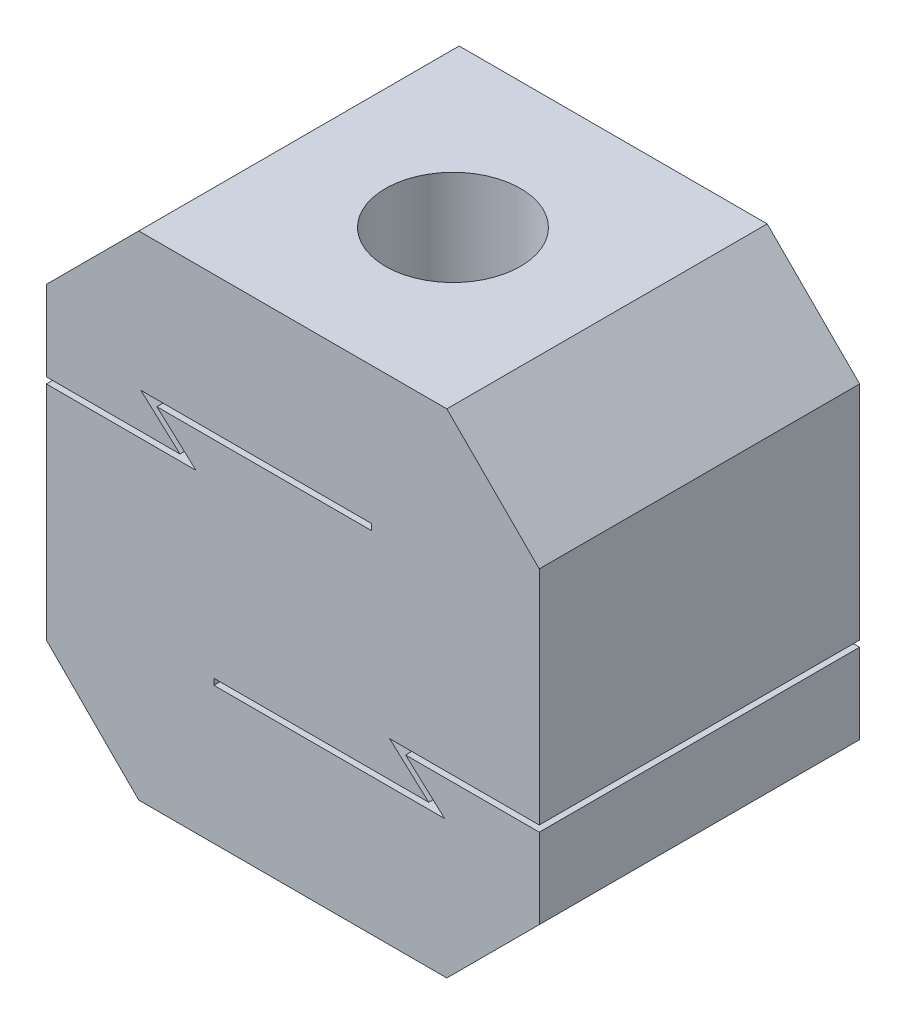
ISO-10303-21;
HEADER;
FILE_DESCRIPTION(('STEP AP214'),'2;1');
FILE_NAME('part.step','',(''),(''),'','','');
FILE_SCHEMA(('AUTOMOTIVE_DESIGN { 1 0 10303 214 1 1 1 1 }'));
ENDSEC;
DATA;
#1=APPLICATION_CONTEXT('core data for automotive mechanical design processes');
#2=APPLICATION_PROTOCOL_DEFINITION('international standard','automotive_design',2000,#1);
#3=PRODUCT_CONTEXT('',#1,'mechanical');
#4=PRODUCT('Part','Part','',(#3));
#5=PRODUCT_RELATED_PRODUCT_CATEGORY('part','',(#4));
#6=PRODUCT_DEFINITION_FORMATION('','',#4);
#7=PRODUCT_DEFINITION_CONTEXT('part definition',#1,'design');
#8=PRODUCT_DEFINITION('design','',#6,#7);
#9=PRODUCT_DEFINITION_SHAPE('','',#8);
#10=(LENGTH_UNIT() NAMED_UNIT(*) SI_UNIT(.MILLI.,.METRE.));
#11=(NAMED_UNIT(*) PLANE_ANGLE_UNIT() SI_UNIT($,.RADIAN.));
#12=(NAMED_UNIT(*) SI_UNIT($,.STERADIAN.) SOLID_ANGLE_UNIT());
#13=UNCERTAINTY_MEASURE_WITH_UNIT(LENGTH_MEASURE(1.E-05),#10,'distance_accuracy_value','');
#14=(GEOMETRIC_REPRESENTATION_CONTEXT(3) GLOBAL_UNCERTAINTY_ASSIGNED_CONTEXT((#13)) GLOBAL_UNIT_ASSIGNED_CONTEXT((#10,
#11,#12)) REPRESENTATION_CONTEXT('',''));
#15=CARTESIAN_POINT('',(0.,0.,0.));
#16=DIRECTION('',(0.,0.,1.));
#17=DIRECTION('',(1.,0.,0.));
#18=AXIS2_PLACEMENT_3D('',#15,#16,#17);
#19=CARTESIAN_POINT('',(40.,40.,52.));
#20=DIRECTION('',(-1.,0.,0.));
#21=DIRECTION('',(0.,-1.,0.));
#22=AXIS2_PLACEMENT_3D('',#19,#20,#21);
#23=PLANE('',#22);
#24=DIRECTION('',(0.,0.,1.));
#25=VECTOR('',#24,1.);
#26=CARTESIAN_POINT('',(40.,-10.9999999999999,52.));
#27=LINE('',#26,#25);
#28=CARTESIAN_POINT('',(40.,-10.9999999999999,0.));
#29=VERTEX_POINT('',#28);
#30=CARTESIAN_POINT('',(40.,-10.9999999999999,52.));
#31=VERTEX_POINT('',#30);
#32=EDGE_CURVE('E243',#29,#31,#27,.T.);
#33=ORIENTED_EDGE('',*,*,#32,.F.);
#34=DIRECTION('',(0.,1.,0.));
#35=VECTOR('',#34,1.);
#36=CARTESIAN_POINT('',(40.,40.,0.));
#37=LINE('',#36,#35);
#38=CARTESIAN_POINT('',(40.,25.,0.));
#39=VERTEX_POINT('',#38);
#40=EDGE_CURVE('E293',#29,#39,#37,.T.);
#41=ORIENTED_EDGE('',*,*,#40,.T.);
#42=DIRECTION('',(0.,0.,1.));
#43=VECTOR('',#42,1.);
#44=CARTESIAN_POINT('',(40.,25.,52.));
#45=LINE('',#44,#43);
#46=CARTESIAN_POINT('',(40.,25.,52.));
#47=VERTEX_POINT('',#46);
#48=EDGE_CURVE('E350',#39,#47,#45,.T.);
#49=ORIENTED_EDGE('',*,*,#48,.T.);
#50=DIRECTION('',(0.,1.,0.));
#51=VECTOR('',#50,1.);
#52=CARTESIAN_POINT('',(40.,40.,52.));
#53=LINE('',#52,#51);
#54=EDGE_CURVE('E298',#31,#47,#53,.T.);
#55=ORIENTED_EDGE('',*,*,#54,.F.);
#56=EDGE_LOOP('',(#33,#41,#49,#55));
#57=FACE_BOUND('',#56,.T.);
#58=ADVANCED_FACE('F41',(#57),#23,.F.);
#59=CARTESIAN_POINT('',(-40.,40.,52.));
#60=DIRECTION('',(1.,0.,0.));
#61=DIRECTION('',(0.,1.,0.));
#62=AXIS2_PLACEMENT_3D('',#59,#60,#61);
#63=PLANE('',#62);
#64=DIRECTION('',(0.,0.,1.));
#65=VECTOR('',#64,1.);
#66=CARTESIAN_POINT('',(-40.,11.,52.));
#67=LINE('',#66,#65);
#68=CARTESIAN_POINT('',(-40.,11.,0.));
#69=VERTEX_POINT('',#68);
#70=CARTESIAN_POINT('',(-40.,11.,52.));
#71=VERTEX_POINT('',#70);
#72=EDGE_CURVE('E288',#69,#71,#67,.T.);
#73=ORIENTED_EDGE('',*,*,#72,.F.);
#74=DIRECTION('',(0.,-1.,0.));
#75=VECTOR('',#74,1.);
#76=CARTESIAN_POINT('',(-40.,40.,0.));
#77=LINE('',#76,#75);
#78=CARTESIAN_POINT('',(-40.,-24.9999999999999,0.));
#79=VERTEX_POINT('',#78);
#80=EDGE_CURVE('E315',#69,#79,#77,.T.);
#81=ORIENTED_EDGE('',*,*,#80,.T.);
#82=DIRECTION('',(0.,0.,1.));
#83=VECTOR('',#82,1.);
#84=CARTESIAN_POINT('',(-40.,-24.9999999999999,52.));
#85=LINE('',#84,#83);
#86=CARTESIAN_POINT('',(-40.,-24.9999999999999,52.));
#87=VERTEX_POINT('',#86);
#88=EDGE_CURVE('E339',#79,#87,#85,.T.);
#89=ORIENTED_EDGE('',*,*,#88,.T.);
#90=DIRECTION('',(0.,-1.,0.));
#91=VECTOR('',#90,1.);
#92=CARTESIAN_POINT('',(-40.,40.,52.));
#93=LINE('',#92,#91);
#94=EDGE_CURVE('E301',#71,#87,#93,.T.);
#95=ORIENTED_EDGE('',*,*,#94,.F.);
#96=EDGE_LOOP('',(#73,#81,#89,#95));
#97=FACE_BOUND('',#96,.T.);
#98=ADVANCED_FACE('F462',(#97),#63,.F.);
#99=CARTESIAN_POINT('',(40.,-25.,0.));
#100=VERTEX_POINT('',#99);
#101=CARTESIAN_POINT('',(40.,-11.9999999999999,0.));
#102=VERTEX_POINT('',#101);
#103=EDGE_CURVE('E309',#100,#102,#37,.T.);
#104=ORIENTED_EDGE('',*,*,#103,.T.);
#105=DIRECTION('',(0.,0.,1.));
#106=VECTOR('',#105,1.);
#107=CARTESIAN_POINT('',(40.,-11.9999999999999,52.));
#108=LINE('',#107,#106);
#109=CARTESIAN_POINT('',(40.,-11.9999999999999,52.));
#110=VERTEX_POINT('',#109);
#111=EDGE_CURVE('E285',#102,#110,#108,.T.);
#112=ORIENTED_EDGE('',*,*,#111,.T.);
#113=CARTESIAN_POINT('',(40.,-25.,52.));
#114=VERTEX_POINT('',#113);
#115=EDGE_CURVE('E294',#114,#110,#53,.T.);
#116=ORIENTED_EDGE('',*,*,#115,.F.);
#117=DIRECTION('',(0.,0.,-1.));
#118=VECTOR('',#117,1.);
#119=CARTESIAN_POINT('',(40.,-25.,52.));
#120=LINE('',#119,#118);
#121=EDGE_CURVE('E353',#114,#100,#120,.T.);
#122=ORIENTED_EDGE('',*,*,#121,.T.);
#123=EDGE_LOOP('',(#104,#112,#116,#122));
#124=FACE_BOUND('',#123,.T.);
#125=ADVANCED_FACE('F441',(#124),#23,.F.);
#126=CARTESIAN_POINT('',(-40.,40.,52.));
#127=DIRECTION('',(0.,-1.,0.));
#128=DIRECTION('',(0.,0.,-1.));
#129=AXIS2_PLACEMENT_3D('',#126,#127,#128);
#130=PLANE('',#129);
#131=CARTESIAN_POINT('',(0.,40.,26.));
#132=DIRECTION('',(0.,1.,0.));
#133=DIRECTION('',(0.,0.,1.));
#134=AXIS2_PLACEMENT_3D('',#131,#132,#133);
#135=CIRCLE('',#134,10.96);
#136=CARTESIAN_POINT('',(0.,40.,36.96));
#137=VERTEX_POINT('',#136);
#138=EDGE_CURVE('E230',#137,#137,#135,.T.);
#139=ORIENTED_EDGE('',*,*,#138,.F.);
#140=EDGE_LOOP('',(#139));
#141=FACE_BOUND('',#140,.T.);
#142=DIRECTION('',(-1.,0.,0.));
#143=VECTOR('',#142,1.);
#144=CARTESIAN_POINT('',(-40.,40.,52.));
#145=LINE('',#144,#143);
#146=CARTESIAN_POINT('',(25.,40.,52.));
#147=VERTEX_POINT('',#146);
#148=CARTESIAN_POINT('',(-25.,40.,52.));
#149=VERTEX_POINT('',#148);
#150=EDGE_CURVE('E297',#147,#149,#145,.T.);
#151=ORIENTED_EDGE('',*,*,#150,.F.);
#152=DIRECTION('',(0.,0.,-1.));
#153=VECTOR('',#152,1.);
#154=CARTESIAN_POINT('',(25.,40.,52.));
#155=LINE('',#154,#153);
#156=CARTESIAN_POINT('',(25.,40.,0.));
#157=VERTEX_POINT('',#156);
#158=EDGE_CURVE('E358',#147,#157,#155,.T.);
#159=ORIENTED_EDGE('',*,*,#158,.T.);
#160=DIRECTION('',(-1.,0.,0.));
#161=VECTOR('',#160,1.);
#162=CARTESIAN_POINT('',(-40.,40.,0.));
#163=LINE('',#162,#161);
#164=CARTESIAN_POINT('',(-25.,40.,0.));
#165=VERTEX_POINT('',#164);
#166=EDGE_CURVE('E312',#157,#165,#163,.T.);
#167=ORIENTED_EDGE('',*,*,#166,.T.);
#168=DIRECTION('',(0.,0.,1.));
#169=VECTOR('',#168,1.);
#170=CARTESIAN_POINT('',(-25.,40.,52.));
#171=LINE('',#170,#169);
#172=EDGE_CURVE('E356',#165,#149,#171,.T.);
#173=ORIENTED_EDGE('',*,*,#172,.T.);
#174=EDGE_LOOP('',(#151,#159,#167,#173));
#175=FACE_BOUND('',#174,.T.);
#176=ADVANCED_FACE('F404',(#141,#175),#130,.F.);
#177=CARTESIAN_POINT('',(-40.,25.,0.));
#178=VERTEX_POINT('',#177);
#179=CARTESIAN_POINT('',(-40.,12.,0.));
#180=VERTEX_POINT('',#179);
#181=EDGE_CURVE('E316',#178,#180,#77,.T.);
#182=ORIENTED_EDGE('',*,*,#181,.T.);
#183=DIRECTION('',(0.,0.,1.));
#184=VECTOR('',#183,1.);
#185=CARTESIAN_POINT('',(-40.,12.,52.));
#186=LINE('',#185,#184);
#187=CARTESIAN_POINT('',(-40.,12.,52.));
#188=VERTEX_POINT('',#187);
#189=EDGE_CURVE('E290',#180,#188,#186,.T.);
#190=ORIENTED_EDGE('',*,*,#189,.T.);
#191=CARTESIAN_POINT('',(-40.,25.,52.));
#192=VERTEX_POINT('',#191);
#193=EDGE_CURVE('E302',#192,#188,#93,.T.);
#194=ORIENTED_EDGE('',*,*,#193,.F.);
#195=DIRECTION('',(0.,0.,-1.));
#196=VECTOR('',#195,1.);
#197=CARTESIAN_POINT('',(-40.,25.,52.));
#198=LINE('',#197,#196);
#199=EDGE_CURVE('E336',#192,#178,#198,.T.);
#200=ORIENTED_EDGE('',*,*,#199,.T.);
#201=EDGE_LOOP('',(#182,#190,#194,#200));
#202=FACE_BOUND('',#201,.T.);
#203=ADVANCED_FACE('F396',(#202),#63,.F.);
#204=CARTESIAN_POINT('',(-40.,-40.,52.));
#205=DIRECTION('',(0.,1.,0.));
#206=DIRECTION('',(0.,0.,1.));
#207=AXIS2_PLACEMENT_3D('',#204,#205,#206);
#208=PLANE('',#207);
#209=CARTESIAN_POINT('',(0.,-40.,26.));
#210=DIRECTION('',(0.,1.,0.));
#211=DIRECTION('',(0.,0.,1.));
#212=AXIS2_PLACEMENT_3D('',#209,#210,#211);
#213=CIRCLE('',#212,10.96);
#214=CARTESIAN_POINT('',(0.,-40.,36.96));
#215=VERTEX_POINT('',#214);
#216=EDGE_CURVE('E586',#215,#215,#213,.T.);
#217=ORIENTED_EDGE('',*,*,#216,.T.);
#218=EDGE_LOOP('',(#217));
#219=FACE_BOUND('',#218,.T.);
#220=DIRECTION('',(1.,0.,0.));
#221=VECTOR('',#220,1.);
#222=CARTESIAN_POINT('',(-40.,-40.,52.));
#223=LINE('',#222,#221);
#224=CARTESIAN_POINT('',(-25.,-40.,52.));
#225=VERTEX_POINT('',#224);
#226=CARTESIAN_POINT('',(24.9999999999999,-40.,52.));
#227=VERTEX_POINT('',#226);
#228=EDGE_CURVE('E305',#225,#227,#223,.T.);
#229=ORIENTED_EDGE('',*,*,#228,.F.);
#230=DIRECTION('',(0.,0.,-1.));
#231=VECTOR('',#230,1.);
#232=CARTESIAN_POINT('',(-25.,-40.,52.));
#233=LINE('',#232,#231);
#234=CARTESIAN_POINT('',(-25.,-40.,0.));
#235=VERTEX_POINT('',#234);
#236=EDGE_CURVE('E323',#225,#235,#233,.T.);
#237=ORIENTED_EDGE('',*,*,#236,.T.);
#238=DIRECTION('',(1.,0.,0.));
#239=VECTOR('',#238,1.);
#240=CARTESIAN_POINT('',(-40.,-40.,0.));
#241=LINE('',#240,#239);
#242=CARTESIAN_POINT('',(24.9999999999999,-40.,0.));
#243=VERTEX_POINT('',#242);
#244=EDGE_CURVE('E319',#235,#243,#241,.T.);
#245=ORIENTED_EDGE('',*,*,#244,.T.);
#246=DIRECTION('',(0.,0.,1.));
#247=VECTOR('',#246,1.);
#248=CARTESIAN_POINT('',(24.9999999999999,-40.,52.));
#249=LINE('',#248,#247);
#250=EDGE_CURVE('E308',#243,#227,#249,.T.);
#251=ORIENTED_EDGE('',*,*,#250,.T.);
#252=EDGE_LOOP('',(#229,#237,#245,#251));
#253=FACE_BOUND('',#252,.T.);
#254=ADVANCED_FACE('F451',(#219,#253),#208,.F.);
#255=CARTESIAN_POINT('',(0.,0.,52.));
#256=DIRECTION('',(0.,0.,1.));
#257=DIRECTION('',(1.,0.,0.));
#258=AXIS2_PLACEMENT_3D('',#255,#256,#257);
#259=PLANE('',#258);
#260=DIRECTION('',(-1.,0.,0.));
#261=VECTOR('',#260,1.);
#262=CARTESIAN_POINT('',(-44.0879895001434,12.,52.));
#263=LINE('',#262,#261);
#264=CARTESIAN_POINT('',(-18.3066568754573,12.,52.));
#265=VERTEX_POINT('',#264);
#266=EDGE_CURVE('E238',#188,#265,#263,.F.);
#267=ORIENTED_EDGE('',*,*,#266,.T.);
#268=DIRECTION('',(-0.739588487785617,0.673059335226089,0.));
#269=VECTOR('',#268,1.);
#270=CARTESIAN_POINT('',(-22.735012780231,16.030006321942,52.));
#271=LINE('',#270,#269);
#272=CARTESIAN_POINT('',(-24.6465524494913,17.7695948097276,52.));
#273=VERTEX_POINT('',#272);
#274=EDGE_CURVE('E219',#265,#273,#271,.T.);
#275=ORIENTED_EDGE('',*,*,#274,.T.);
#276=DIRECTION('',(-1.,0.,0.));
#277=VECTOR('',#276,1.);
#278=CARTESIAN_POINT('',(-22.0619534450049,17.7695948097276,52.));
#279=LINE('',#278,#277);
#280=CARTESIAN_POINT('',(12.8105656726429,17.7695948097276,52.));
#281=VERTEX_POINT('',#280);
#282=EDGE_CURVE('E209',#273,#281,#279,.F.);
#283=ORIENTED_EDGE('',*,*,#282,.T.);
#284=DIRECTION('',(0.,1.,0.));
#285=VECTOR('',#284,1.);
#286=CARTESIAN_POINT('',(12.8105656726429,16.7695948097276,52.));
#287=LINE('',#286,#285);
#288=CARTESIAN_POINT('',(12.8105656726429,16.7695948097276,52.));
#289=VERTEX_POINT('',#288);
#290=EDGE_CURVE('E201',#289,#281,#287,.T.);
#291=ORIENTED_EDGE('',*,*,#290,.F.);
#292=DIRECTION('',(1.,0.,0.));
#293=VECTOR('',#292,1.);
#294=CARTESIAN_POINT('',(-22.0619534450049,16.7695948097276,52.));
#295=LINE('',#294,#293);
#296=CARTESIAN_POINT('',(-22.0619534450049,16.7695948097276,52.));
#297=VERTEX_POINT('',#296);
#298=EDGE_CURVE('E208',#297,#289,#295,.T.);
#299=ORIENTED_EDGE('',*,*,#298,.F.);
#300=DIRECTION('',(-0.739588487785617,0.673059335226089,0.));
#301=VECTOR('',#300,1.);
#302=CARTESIAN_POINT('',(-22.0619534450049,16.7695948097276,52.));
#303=LINE('',#302,#301);
#304=CARTESIAN_POINT('',(-15.7220578709709,11.,52.));
#305=VERTEX_POINT('',#304);
#306=EDGE_CURVE('E234',#305,#297,#303,.T.);
#307=ORIENTED_EDGE('',*,*,#306,.F.);
#308=DIRECTION('',(1.,0.,0.));
#309=VECTOR('',#308,1.);
#310=CARTESIAN_POINT('',(-44.0879895001434,11.,52.));
#311=LINE('',#310,#309);
#312=EDGE_CURVE('E236',#71,#305,#311,.T.);
#313=ORIENTED_EDGE('',*,*,#312,.F.);
#314=ORIENTED_EDGE('',*,*,#94,.T.);
#315=DIRECTION('',(-0.707106781186546,0.707106781186549,0.));
#316=VECTOR('',#315,1.);
#317=CARTESIAN_POINT('',(-32.5000000000001,-32.4999999999999,52.));
#318=LINE('',#317,#316);
#319=EDGE_CURVE('E348',#87,#225,#318,.F.);
#320=ORIENTED_EDGE('',*,*,#319,.T.);
#321=ORIENTED_EDGE('',*,*,#228,.T.);
#322=DIRECTION('',(-0.70710678118655,-0.707106781186546,0.));
#323=VECTOR('',#322,1.);
#324=CARTESIAN_POINT('',(32.4999999999999,-32.5000000000001,52.));
#325=LINE('',#324,#323);
#326=EDGE_CURVE('E346',#227,#114,#325,.F.);
#327=ORIENTED_EDGE('',*,*,#326,.T.);
#328=ORIENTED_EDGE('',*,*,#115,.T.);
#329=DIRECTION('',(-1.,0.,0.));
#330=VECTOR('',#329,1.);
#331=CARTESIAN_POINT('',(43.1519387676563,-11.9999999999999,52.));
#332=LINE('',#331,#330);
#333=CARTESIAN_POINT('',(18.3066568754573,-11.9999999999999,52.));
#334=VERTEX_POINT('',#333);
#335=EDGE_CURVE('E266',#110,#334,#332,.T.);
#336=ORIENTED_EDGE('',*,*,#335,.T.);
#337=DIRECTION('',(0.739588487785618,-0.673059335226087,0.));
#338=VECTOR('',#337,1.);
#339=CARTESIAN_POINT('',(22.735012780231,-16.0300063219419,52.));
#340=LINE('',#339,#338);
#341=CARTESIAN_POINT('',(24.6465524494913,-17.7695948097275,52.));
#342=VERTEX_POINT('',#341);
#343=EDGE_CURVE('E269',#334,#342,#340,.T.);
#344=ORIENTED_EDGE('',*,*,#343,.T.);
#345=DIRECTION('',(-1.,0.,0.));
#346=VECTOR('',#345,1.);
#347=CARTESIAN_POINT('',(22.061953445005,-17.7695948097275,52.));
#348=LINE('',#347,#346);
#349=CARTESIAN_POINT('',(-12.8105656726429,-17.7695948097276,52.));
#350=VERTEX_POINT('',#349);
#351=EDGE_CURVE('E254',#342,#350,#348,.T.);
#352=ORIENTED_EDGE('',*,*,#351,.T.);
#353=DIRECTION('',(0.,-1.,0.));
#354=VECTOR('',#353,1.);
#355=CARTESIAN_POINT('',(-12.8105656726429,-16.7695948097276,52.));
#356=LINE('',#355,#354);
#357=CARTESIAN_POINT('',(-12.8105656726429,-16.7695948097276,52.));
#358=VERTEX_POINT('',#357);
#359=EDGE_CURVE('E257',#358,#350,#356,.T.);
#360=ORIENTED_EDGE('',*,*,#359,.F.);
#361=DIRECTION('',(-1.,0.,0.));
#362=VECTOR('',#361,1.);
#363=CARTESIAN_POINT('',(22.061953445005,-16.7695948097275,52.));
#364=LINE('',#363,#362);
#365=CARTESIAN_POINT('',(22.061953445005,-16.7695948097275,52.));
#366=VERTEX_POINT('',#365);
#367=EDGE_CURVE('E260',#366,#358,#364,.T.);
#368=ORIENTED_EDGE('',*,*,#367,.F.);
#369=DIRECTION('',(0.739588487785618,-0.673059335226087,0.));
#370=VECTOR('',#369,1.);
#371=CARTESIAN_POINT('',(22.061953445005,-16.7695948097275,52.));
#372=LINE('',#371,#370);
#373=CARTESIAN_POINT('',(15.7220578709709,-10.9999999999999,52.));
#374=VERTEX_POINT('',#373);
#375=EDGE_CURVE('E262',#374,#366,#372,.T.);
#376=ORIENTED_EDGE('',*,*,#375,.F.);
#377=DIRECTION('',(-1.,0.,0.));
#378=VECTOR('',#377,1.);
#379=CARTESIAN_POINT('',(43.1519387676563,-10.9999999999999,52.));
#380=LINE('',#379,#378);
#381=EDGE_CURVE('E264',#31,#374,#380,.T.);
#382=ORIENTED_EDGE('',*,*,#381,.F.);
#383=ORIENTED_EDGE('',*,*,#54,.T.);
#384=DIRECTION('',(0.707106781186547,-0.707106781186548,0.));
#385=VECTOR('',#384,1.);
#386=CARTESIAN_POINT('',(32.5,32.4999999999999,52.));
#387=LINE('',#386,#385);
#388=EDGE_CURVE('E344',#47,#147,#387,.F.);
#389=ORIENTED_EDGE('',*,*,#388,.T.);
#390=ORIENTED_EDGE('',*,*,#150,.T.);
#391=DIRECTION('',(0.707106781186549,0.707106781186546,0.));
#392=VECTOR('',#391,1.);
#393=CARTESIAN_POINT('',(-32.4999999999999,32.5000000000001,52.));
#394=LINE('',#393,#392);
#395=EDGE_CURVE('E342',#149,#192,#394,.F.);
#396=ORIENTED_EDGE('',*,*,#395,.T.);
#397=ORIENTED_EDGE('',*,*,#193,.T.);
#398=EDGE_LOOP('',(#267,#275,#283,#291,#299,#307,#313,#314,#320,#321,#327,#328,#336,#344,#352,
#360,#368,#376,#382,#383,#389,#390,#396,#397));
#399=FACE_BOUND('',#398,.T.);
#400=ADVANCED_FACE('F222',(#399),#259,.T.);
#401=CARTESIAN_POINT('',(0.,0.,0.));
#402=DIRECTION('',(0.,0.,1.));
#403=DIRECTION('',(1.,0.,0.));
#404=AXIS2_PLACEMENT_3D('',#401,#402,#403);
#405=PLANE('',#404);
#406=DIRECTION('',(0.739588487785617,-0.673059335226089,0.));
#407=VECTOR('',#406,1.);
#408=CARTESIAN_POINT('',(-2.31963469031216,-2.54892105797291,0.));
#409=LINE('',#408,#407);
#410=CARTESIAN_POINT('',(-24.6465524494913,17.7695948097276,0.));
#411=VERTEX_POINT('',#410);
#412=CARTESIAN_POINT('',(-18.3066568754573,12.,0.));
#413=VERTEX_POINT('',#412);
#414=EDGE_CURVE('E49',#411,#413,#409,.T.);
#415=ORIENTED_EDGE('',*,*,#414,.T.);
#416=DIRECTION('',(-1.,0.,0.));
#417=VECTOR('',#416,1.);
#418=CARTESIAN_POINT('',(0.,12.,0.));
#419=LINE('',#418,#417);
#420=EDGE_CURVE('E11',#413,#180,#419,.T.);
#421=ORIENTED_EDGE('',*,*,#420,.T.);
#422=ORIENTED_EDGE('',*,*,#181,.F.);
#423=DIRECTION('',(-0.707106781186549,-0.707106781186546,0.));
#424=VECTOR('',#423,1.);
#425=CARTESIAN_POINT('',(-40.,25.,0.));
#426=LINE('',#425,#424);
#427=EDGE_CURVE('E326',#178,#165,#426,.F.);
#428=ORIENTED_EDGE('',*,*,#427,.T.);
#429=ORIENTED_EDGE('',*,*,#166,.F.);
#430=DIRECTION('',(-0.707106781186547,0.707106781186548,0.));
#431=VECTOR('',#430,1.);
#432=CARTESIAN_POINT('',(25.,40.,0.));
#433=LINE('',#432,#431);
#434=EDGE_CURVE('E328',#157,#39,#433,.F.);
#435=ORIENTED_EDGE('',*,*,#434,.T.);
#436=ORIENTED_EDGE('',*,*,#40,.F.);
#437=DIRECTION('',(1.,0.,0.));
#438=VECTOR('',#437,1.);
#439=CARTESIAN_POINT('',(0.,-10.9999999999999,0.));
#440=LINE('',#439,#438);
#441=CARTESIAN_POINT('',(15.7220578709709,-10.9999999999999,0.));
#442=VERTEX_POINT('',#441);
#443=EDGE_CURVE('E367',#442,#29,#440,.T.);
#444=ORIENTED_EDGE('',*,*,#443,.F.);
#445=DIRECTION('',(-0.739588487785618,0.673059335226087,0.));
#446=VECTOR('',#445,1.);
#447=CARTESIAN_POINT('',(1.64657535508608,1.80933257018731,0.));
#448=LINE('',#447,#446);
#449=CARTESIAN_POINT('',(22.061953445005,-16.7695948097275,0.));
#450=VERTEX_POINT('',#449);
#451=EDGE_CURVE('E365',#450,#442,#448,.T.);
#452=ORIENTED_EDGE('',*,*,#451,.F.);
#453=DIRECTION('',(1.,0.,0.));
#454=VECTOR('',#453,1.);
#455=CARTESIAN_POINT('',(0.,-16.7695948097276,0.));
#456=LINE('',#455,#454);
#457=CARTESIAN_POINT('',(-12.8105656726429,-16.7695948097276,0.));
#458=VERTEX_POINT('',#457);
#459=EDGE_CURVE('E363',#458,#450,#456,.T.);
#460=ORIENTED_EDGE('',*,*,#459,.F.);
#461=DIRECTION('',(0.,1.,0.));
#462=VECTOR('',#461,1.);
#463=CARTESIAN_POINT('',(-12.810565672643,0.,0.));
#464=LINE('',#463,#462);
#465=CARTESIAN_POINT('',(-12.8105656726429,-17.7695948097276,0.));
#466=VERTEX_POINT('',#465);
#467=EDGE_CURVE('E361',#466,#458,#464,.T.);
#468=ORIENTED_EDGE('',*,*,#467,.F.);
#469=DIRECTION('',(1.,0.,0.));
#470=VECTOR('',#469,1.);
#471=CARTESIAN_POINT('',(0.,-17.7695948097276,0.));
#472=LINE('',#471,#470);
#473=CARTESIAN_POINT('',(24.6465524494913,-17.7695948097275,0.));
#474=VERTEX_POINT('',#473);
#475=EDGE_CURVE('E369',#466,#474,#472,.T.);
#476=ORIENTED_EDGE('',*,*,#475,.T.);
#477=DIRECTION('',(-0.739588487785618,0.673059335226087,0.));
#478=VECTOR('',#477,1.);
#479=CARTESIAN_POINT('',(2.31963469031217,2.54892105797293,0.));
#480=LINE('',#479,#478);
#481=CARTESIAN_POINT('',(18.3066568754573,-11.9999999999999,0.));
#482=VERTEX_POINT('',#481);
#483=EDGE_CURVE('E372',#474,#482,#480,.T.);
#484=ORIENTED_EDGE('',*,*,#483,.T.);
#485=DIRECTION('',(1.,0.,0.));
#486=VECTOR('',#485,1.);
#487=CARTESIAN_POINT('',(0.,-11.9999999999999,0.));
#488=LINE('',#487,#486);
#489=EDGE_CURVE('E375',#482,#102,#488,.T.);
#490=ORIENTED_EDGE('',*,*,#489,.T.);
#491=ORIENTED_EDGE('',*,*,#103,.F.);
#492=DIRECTION('',(0.70710678118655,0.707106781186546,0.));
#493=VECTOR('',#492,1.);
#494=CARTESIAN_POINT('',(40.,-25.,0.));
#495=LINE('',#494,#493);
#496=EDGE_CURVE('E331',#100,#243,#495,.F.);
#497=ORIENTED_EDGE('',*,*,#496,.T.);
#498=ORIENTED_EDGE('',*,*,#244,.F.);
#499=DIRECTION('',(0.707106781186546,-0.707106781186549,0.));
#500=VECTOR('',#499,1.);
#501=CARTESIAN_POINT('',(-25.,-40.,0.));
#502=LINE('',#501,#500);
#503=EDGE_CURVE('E333',#235,#79,#502,.F.);
#504=ORIENTED_EDGE('',*,*,#503,.T.);
#505=ORIENTED_EDGE('',*,*,#80,.F.);
#506=DIRECTION('',(-1.,0.,0.));
#507=VECTOR('',#506,1.);
#508=CARTESIAN_POINT('',(0.,11.,0.));
#509=LINE('',#508,#507);
#510=CARTESIAN_POINT('',(-15.7220578709709,11.,0.));
#511=VERTEX_POINT('',#510);
#512=EDGE_CURVE('E384',#511,#69,#509,.T.);
#513=ORIENTED_EDGE('',*,*,#512,.F.);
#514=DIRECTION('',(0.739588487785617,-0.673059335226089,0.));
#515=VECTOR('',#514,1.);
#516=CARTESIAN_POINT('',(-1.64657535508607,-1.8093325701873,0.));
#517=LINE('',#516,#515);
#518=CARTESIAN_POINT('',(-22.0619534450049,16.7695948097276,0.));
#519=VERTEX_POINT('',#518);
#520=EDGE_CURVE('E382',#519,#511,#517,.T.);
#521=ORIENTED_EDGE('',*,*,#520,.F.);
#522=DIRECTION('',(-1.,0.,0.));
#523=VECTOR('',#522,1.);
#524=CARTESIAN_POINT('',(0.,16.7695948097276,0.));
#525=LINE('',#524,#523);
#526=CARTESIAN_POINT('',(12.8105656726429,16.7695948097276,0.));
#527=VERTEX_POINT('',#526);
#528=EDGE_CURVE('E380',#527,#519,#525,.T.);
#529=ORIENTED_EDGE('',*,*,#528,.F.);
#530=DIRECTION('',(0.,-1.,0.));
#531=VECTOR('',#530,1.);
#532=CARTESIAN_POINT('',(12.8105656726429,0.,0.));
#533=LINE('',#532,#531);
#534=CARTESIAN_POINT('',(12.8105656726429,17.7695948097276,0.));
#535=VERTEX_POINT('',#534);
#536=EDGE_CURVE('E378',#535,#527,#533,.T.);
#537=ORIENTED_EDGE('',*,*,#536,.F.);
#538=DIRECTION('',(-1.,0.,0.));
#539=VECTOR('',#538,1.);
#540=CARTESIAN_POINT('',(0.,17.7695948097276,0.));
#541=LINE('',#540,#539);
#542=EDGE_CURVE('E217',#535,#411,#541,.T.);
#543=ORIENTED_EDGE('',*,*,#542,.T.);
#544=EDGE_LOOP('',(#415,#421,#422,#428,#429,#435,#436,#444,#452,#460,#468,#476,#484,#490,#491,
#497,#498,#504,#505,#513,#521,#529,#537,#543));
#545=FACE_BOUND('',#544,.T.);
#546=ADVANCED_FACE('F388',(#545),#405,.F.);
#547=CARTESIAN_POINT('',(-25.,-40.,52.));
#548=DIRECTION('',(0.707106781186549,0.707106781186546,0.));
#549=DIRECTION('',(0.,0.,-1.));
#550=AXIS2_PLACEMENT_3D('',#547,#548,#549);
#551=PLANE('',#550);
#552=ORIENTED_EDGE('',*,*,#319,.F.);
#553=ORIENTED_EDGE('',*,*,#88,.F.);
#554=ORIENTED_EDGE('',*,*,#503,.F.);
#555=ORIENTED_EDGE('',*,*,#236,.F.);
#556=EDGE_LOOP('',(#552,#553,#554,#555));
#557=FACE_BOUND('',#556,.T.);
#558=ADVANCED_FACE('F455',(#557),#551,.F.);
#559=CARTESIAN_POINT('',(40.,-25.,52.));
#560=DIRECTION('',(-0.707106781186545,0.707106781186549,0.));
#561=DIRECTION('',(0.,0.,-1.));
#562=AXIS2_PLACEMENT_3D('',#559,#560,#561);
#563=PLANE('',#562);
#564=ORIENTED_EDGE('',*,*,#326,.F.);
#565=ORIENTED_EDGE('',*,*,#250,.F.);
#566=ORIENTED_EDGE('',*,*,#496,.F.);
#567=ORIENTED_EDGE('',*,*,#121,.F.);
#568=EDGE_LOOP('',(#564,#565,#566,#567));
#569=FACE_BOUND('',#568,.T.);
#570=ADVANCED_FACE('F446',(#569),#563,.F.);
#571=CARTESIAN_POINT('',(25.,40.,52.));
#572=DIRECTION('',(-0.707106781186548,-0.707106781186547,0.));
#573=DIRECTION('',(0.,0.,-1.));
#574=AXIS2_PLACEMENT_3D('',#571,#572,#573);
#575=PLANE('',#574);
#576=ORIENTED_EDGE('',*,*,#388,.F.);
#577=ORIENTED_EDGE('',*,*,#48,.F.);
#578=ORIENTED_EDGE('',*,*,#434,.F.);
#579=ORIENTED_EDGE('',*,*,#158,.F.);
#580=EDGE_LOOP('',(#576,#577,#578,#579));
#581=FACE_BOUND('',#580,.T.);
#582=ADVANCED_FACE('F408',(#581),#575,.F.);
#583=CARTESIAN_POINT('',(-40.,25.,52.));
#584=DIRECTION('',(0.707106781186546,-0.707106781186549,0.));
#585=DIRECTION('',(0.,0.,-1.));
#586=AXIS2_PLACEMENT_3D('',#583,#584,#585);
#587=PLANE('',#586);
#588=ORIENTED_EDGE('',*,*,#395,.F.);
#589=ORIENTED_EDGE('',*,*,#172,.F.);
#590=ORIENTED_EDGE('',*,*,#427,.F.);
#591=ORIENTED_EDGE('',*,*,#199,.F.);
#592=EDGE_LOOP('',(#588,#589,#590,#591));
#593=FACE_BOUND('',#592,.T.);
#594=ADVANCED_FACE('F43',(#593),#587,.F.);
#595=CARTESIAN_POINT('',(22.061953445005,-17.7695948097275,52.));
#596=DIRECTION('',(0.,-1.,0.));
#597=DIRECTION('',(1.,0.,0.));
#598=AXIS2_PLACEMENT_3D('',#595,#596,#597);
#599=PLANE('',#598);
#600=DIRECTION('',(0.,0.,-1.));
#601=VECTOR('',#600,1.);
#602=CARTESIAN_POINT('',(-12.8105656726429,-17.7695948097276,52.));
#603=LINE('',#602,#601);
#604=EDGE_CURVE('E64',#350,#466,#603,.T.);
#605=ORIENTED_EDGE('',*,*,#604,.F.);
#606=ORIENTED_EDGE('',*,*,#351,.F.);
#607=DIRECTION('',(0.,0.,-1.));
#608=VECTOR('',#607,1.);
#609=CARTESIAN_POINT('',(24.6465524494913,-17.7695948097275,52.));
#610=LINE('',#609,#608);
#611=EDGE_CURVE('E224',#342,#474,#610,.T.);
#612=ORIENTED_EDGE('',*,*,#611,.T.);
#613=ORIENTED_EDGE('',*,*,#475,.F.);
#614=EDGE_LOOP('',(#605,#606,#612,#613));
#615=FACE_BOUND('',#614,.T.);
#616=ADVANCED_FACE('F435',(#615),#599,.F.);
#617=CARTESIAN_POINT('',(22.735012780231,-16.0300063219419,52.));
#618=DIRECTION('',(0.673059335226087,0.739588487785618,0.));
#619=DIRECTION('',(-0.739588487785618,0.673059335226087,0.));
#620=AXIS2_PLACEMENT_3D('',#617,#618,#619);
#621=PLANE('',#620);
#622=ORIENTED_EDGE('',*,*,#611,.F.);
#623=ORIENTED_EDGE('',*,*,#343,.F.);
#624=DIRECTION('',(0.,0.,-1.));
#625=VECTOR('',#624,1.);
#626=CARTESIAN_POINT('',(18.3066568754573,-11.9999999999999,52.));
#627=LINE('',#626,#625);
#628=EDGE_CURVE('E227',#334,#482,#627,.T.);
#629=ORIENTED_EDGE('',*,*,#628,.T.);
#630=ORIENTED_EDGE('',*,*,#483,.F.);
#631=EDGE_LOOP('',(#622,#623,#629,#630));
#632=FACE_BOUND('',#631,.T.);
#633=ADVANCED_FACE('F437',(#632),#621,.F.);
#634=CARTESIAN_POINT('',(43.1519387676563,-11.9999999999999,52.));
#635=DIRECTION('',(0.,-1.,0.));
#636=DIRECTION('',(0.,0.,-1.));
#637=AXIS2_PLACEMENT_3D('',#634,#635,#636);
#638=PLANE('',#637);
#639=ORIENTED_EDGE('',*,*,#489,.F.);
#640=ORIENTED_EDGE('',*,*,#628,.F.);
#641=ORIENTED_EDGE('',*,*,#335,.F.);
#642=ORIENTED_EDGE('',*,*,#111,.F.);
#643=EDGE_LOOP('',(#639,#640,#641,#642));
#644=FACE_BOUND('',#643,.T.);
#645=ADVANCED_FACE('F521',(#644),#638,.F.);
#646=CARTESIAN_POINT('',(43.1519387676563,-10.9999999999999,52.));
#647=DIRECTION('',(0.,-1.,0.));
#648=DIRECTION('',(0.,0.,-1.));
#649=AXIS2_PLACEMENT_3D('',#646,#647,#648);
#650=PLANE('',#649);
#651=ORIENTED_EDGE('',*,*,#32,.T.);
#652=ORIENTED_EDGE('',*,*,#381,.T.);
#653=DIRECTION('',(0.,0.,-1.));
#654=VECTOR('',#653,1.);
#655=CARTESIAN_POINT('',(15.7220578709709,-10.9999999999999,52.));
#656=LINE('',#655,#654);
#657=EDGE_CURVE('E274',#374,#442,#656,.T.);
#658=ORIENTED_EDGE('',*,*,#657,.T.);
#659=ORIENTED_EDGE('',*,*,#443,.T.);
#660=EDGE_LOOP('',(#651,#652,#658,#659));
#661=FACE_BOUND('',#660,.T.);
#662=ADVANCED_FACE('F418',(#661),#650,.T.);
#663=CARTESIAN_POINT('',(22.061953445005,-16.7695948097275,52.));
#664=DIRECTION('',(0.673059335226087,0.739588487785618,0.));
#665=DIRECTION('',(-0.739588487785618,0.673059335226087,0.));
#666=AXIS2_PLACEMENT_3D('',#663,#664,#665);
#667=PLANE('',#666);
#668=ORIENTED_EDGE('',*,*,#451,.T.);
#669=ORIENTED_EDGE('',*,*,#657,.F.);
#670=ORIENTED_EDGE('',*,*,#375,.T.);
#671=DIRECTION('',(0.,0.,-1.));
#672=VECTOR('',#671,1.);
#673=CARTESIAN_POINT('',(22.061953445005,-16.7695948097275,52.));
#674=LINE('',#673,#672);
#675=EDGE_CURVE('E277',#366,#450,#674,.T.);
#676=ORIENTED_EDGE('',*,*,#675,.T.);
#677=EDGE_LOOP('',(#668,#669,#670,#676));
#678=FACE_BOUND('',#677,.T.);
#679=ADVANCED_FACE('F425',(#678),#667,.T.);
#680=CARTESIAN_POINT('',(22.061953445005,-16.7695948097275,52.));
#681=DIRECTION('',(0.,-1.,0.));
#682=DIRECTION('',(1.,0.,0.));
#683=AXIS2_PLACEMENT_3D('',#680,#681,#682);
#684=PLANE('',#683);
#685=ORIENTED_EDGE('',*,*,#459,.T.);
#686=ORIENTED_EDGE('',*,*,#675,.F.);
#687=ORIENTED_EDGE('',*,*,#367,.T.);
#688=DIRECTION('',(0.,0.,-1.));
#689=VECTOR('',#688,1.);
#690=CARTESIAN_POINT('',(-12.8105656726429,-16.7695948097276,52.));
#691=LINE('',#690,#689);
#692=EDGE_CURVE('E280',#358,#458,#691,.T.);
#693=ORIENTED_EDGE('',*,*,#692,.T.);
#694=EDGE_LOOP('',(#685,#686,#687,#693));
#695=FACE_BOUND('',#694,.T.);
#696=ADVANCED_FACE('F427',(#695),#684,.T.);
#697=CARTESIAN_POINT('',(-12.8105656726429,-16.7695948097276,52.));
#698=DIRECTION('',(1.,0.,0.));
#699=DIRECTION('',(0.,1.,0.));
#700=AXIS2_PLACEMENT_3D('',#697,#698,#699);
#701=PLANE('',#700);
#702=ORIENTED_EDGE('',*,*,#467,.T.);
#703=ORIENTED_EDGE('',*,*,#692,.F.);
#704=ORIENTED_EDGE('',*,*,#359,.T.);
#705=ORIENTED_EDGE('',*,*,#604,.T.);
#706=EDGE_LOOP('',(#702,#703,#704,#705));
#707=FACE_BOUND('',#706,.T.);
#708=ADVANCED_FACE('F431',(#707),#701,.T.);
#709=CARTESIAN_POINT('',(-22.0619534450049,17.7695948097276,52.));
#710=DIRECTION('',(0.,1.,0.));
#711=DIRECTION('',(0.,0.,1.));
#712=AXIS2_PLACEMENT_3D('',#709,#710,#711);
#713=PLANE('',#712);
#714=DIRECTION('',(0.,0.,-1.));
#715=VECTOR('',#714,1.);
#716=CARTESIAN_POINT('',(12.8105656726429,17.7695948097276,52.));
#717=LINE('',#716,#715);
#718=EDGE_CURVE('E56',#281,#535,#717,.T.);
#719=ORIENTED_EDGE('',*,*,#718,.F.);
#720=ORIENTED_EDGE('',*,*,#282,.F.);
#721=DIRECTION('',(0.,0.,-1.));
#722=VECTOR('',#721,1.);
#723=CARTESIAN_POINT('',(-24.6465524494913,17.7695948097276,52.));
#724=LINE('',#723,#722);
#725=EDGE_CURVE('E241',#273,#411,#724,.T.);
#726=ORIENTED_EDGE('',*,*,#725,.T.);
#727=ORIENTED_EDGE('',*,*,#542,.F.);
#728=EDGE_LOOP('',(#719,#720,#726,#727));
#729=FACE_BOUND('',#728,.T.);
#730=ADVANCED_FACE('F213',(#729),#713,.F.);
#731=CARTESIAN_POINT('',(-22.735012780231,16.030006321942,52.));
#732=DIRECTION('',(-0.673059335226089,-0.739588487785617,0.));
#733=DIRECTION('',(0.739588487785617,-0.673059335226089,0.));
#734=AXIS2_PLACEMENT_3D('',#731,#732,#733);
#735=PLANE('',#734);
#736=ORIENTED_EDGE('',*,*,#725,.F.);
#737=ORIENTED_EDGE('',*,*,#274,.F.);
#738=DIRECTION('',(0.,0.,-1.));
#739=VECTOR('',#738,1.);
#740=CARTESIAN_POINT('',(-18.3066568754573,12.,52.));
#741=LINE('',#740,#739);
#742=EDGE_CURVE('E244',#265,#413,#741,.T.);
#743=ORIENTED_EDGE('',*,*,#742,.T.);
#744=ORIENTED_EDGE('',*,*,#414,.F.);
#745=EDGE_LOOP('',(#736,#737,#743,#744));
#746=FACE_BOUND('',#745,.T.);
#747=ADVANCED_FACE('F391',(#746),#735,.F.);
#748=CARTESIAN_POINT('',(-44.0879895001434,12.,52.));
#749=DIRECTION('',(0.,1.,0.));
#750=DIRECTION('',(0.,0.,1.));
#751=AXIS2_PLACEMENT_3D('',#748,#749,#750);
#752=PLANE('',#751);
#753=ORIENTED_EDGE('',*,*,#420,.F.);
#754=ORIENTED_EDGE('',*,*,#742,.F.);
#755=ORIENTED_EDGE('',*,*,#266,.F.);
#756=ORIENTED_EDGE('',*,*,#189,.F.);
#757=EDGE_LOOP('',(#753,#754,#755,#756));
#758=FACE_BOUND('',#757,.T.);
#759=ADVANCED_FACE('F393',(#758),#752,.F.);
#760=CARTESIAN_POINT('',(-44.0879895001434,11.,52.));
#761=DIRECTION('',(0.,1.,0.));
#762=DIRECTION('',(0.,0.,1.));
#763=AXIS2_PLACEMENT_3D('',#760,#761,#762);
#764=PLANE('',#763);
#765=ORIENTED_EDGE('',*,*,#72,.T.);
#766=ORIENTED_EDGE('',*,*,#312,.T.);
#767=DIRECTION('',(0.,0.,-1.));
#768=VECTOR('',#767,1.);
#769=CARTESIAN_POINT('',(-15.7220578709709,11.,52.));
#770=LINE('',#769,#768);
#771=EDGE_CURVE('E247',#305,#511,#770,.T.);
#772=ORIENTED_EDGE('',*,*,#771,.T.);
#773=ORIENTED_EDGE('',*,*,#512,.T.);
#774=EDGE_LOOP('',(#765,#766,#772,#773));
#775=FACE_BOUND('',#774,.T.);
#776=ADVANCED_FACE('F466',(#775),#764,.T.);
#777=CARTESIAN_POINT('',(-22.0619534450049,16.7695948097276,52.));
#778=DIRECTION('',(-0.673059335226089,-0.739588487785617,0.));
#779=DIRECTION('',(0.739588487785617,-0.673059335226089,0.));
#780=AXIS2_PLACEMENT_3D('',#777,#778,#779);
#781=PLANE('',#780);
#782=ORIENTED_EDGE('',*,*,#520,.T.);
#783=ORIENTED_EDGE('',*,*,#771,.F.);
#784=ORIENTED_EDGE('',*,*,#306,.T.);
#785=DIRECTION('',(0.,0.,-1.));
#786=VECTOR('',#785,1.);
#787=CARTESIAN_POINT('',(-22.0619534450049,16.7695948097276,52.));
#788=LINE('',#787,#786);
#789=EDGE_CURVE('E250',#297,#519,#788,.T.);
#790=ORIENTED_EDGE('',*,*,#789,.T.);
#791=EDGE_LOOP('',(#782,#783,#784,#790));
#792=FACE_BOUND('',#791,.T.);
#793=ADVANCED_FACE('F471',(#792),#781,.T.);
#794=CARTESIAN_POINT('',(-22.0619534450049,16.7695948097276,52.));
#795=DIRECTION('',(0.,1.,0.));
#796=DIRECTION('',(0.,0.,1.));
#797=AXIS2_PLACEMENT_3D('',#794,#795,#796);
#798=PLANE('',#797);
#799=ORIENTED_EDGE('',*,*,#528,.T.);
#800=ORIENTED_EDGE('',*,*,#789,.F.);
#801=ORIENTED_EDGE('',*,*,#298,.T.);
#802=DIRECTION('',(0.,0.,-1.));
#803=VECTOR('',#802,1.);
#804=CARTESIAN_POINT('',(12.8105656726429,16.7695948097276,52.));
#805=LINE('',#804,#803);
#806=EDGE_CURVE('E204',#289,#527,#805,.T.);
#807=ORIENTED_EDGE('',*,*,#806,.T.);
#808=EDGE_LOOP('',(#799,#800,#801,#807));
#809=FACE_BOUND('',#808,.T.);
#810=ADVANCED_FACE('F473',(#809),#798,.T.);
#811=CARTESIAN_POINT('',(12.8105656726429,16.7695948097276,52.));
#812=DIRECTION('',(-1.,0.,0.));
#813=DIRECTION('',(0.,0.,1.));
#814=AXIS2_PLACEMENT_3D('',#811,#812,#813);
#815=PLANE('',#814);
#816=ORIENTED_EDGE('',*,*,#536,.T.);
#817=ORIENTED_EDGE('',*,*,#806,.F.);
#818=ORIENTED_EDGE('',*,*,#290,.T.);
#819=ORIENTED_EDGE('',*,*,#718,.T.);
#820=EDGE_LOOP('',(#816,#817,#818,#819));
#821=FACE_BOUND('',#820,.T.);
#822=ADVANCED_FACE('F202',(#821),#815,.T.);
#823=CARTESIAN_POINT('',(0.,24.,26.));
#824=DIRECTION('',(0.,1.,0.));
#825=DIRECTION('',(0.,0.,1.));
#826=AXIS2_PLACEMENT_3D('',#823,#824,#825);
#827=CYLINDRICAL_SURFACE('',#826,10.96);
#828=CARTESIAN_POINT('',(0.,24.,26.));
#829=DIRECTION('',(0.,1.,0.));
#830=DIRECTION('',(0.,0.,1.));
#831=AXIS2_PLACEMENT_3D('',#828,#829,#830);
#832=CIRCLE('',#831,10.96);
#833=CARTESIAN_POINT('',(0.,24.,36.96));
#834=VERTEX_POINT('',#833);
#835=EDGE_CURVE('E258',#834,#834,#832,.T.);
#836=ORIENTED_EDGE('',*,*,#835,.F.);
#837=EDGE_LOOP('',(#836));
#838=FACE_BOUND('',#837,.T.);
#839=ORIENTED_EDGE('',*,*,#138,.T.);
#840=EDGE_LOOP('',(#839));
#841=FACE_BOUND('',#840,.T.);
#842=ADVANCED_FACE('F481',(#838,#841),#827,.F.);
#843=CARTESIAN_POINT('',(0.,24.,26.));
#844=DIRECTION('',(0.,1.,0.));
#845=DIRECTION('',(0.,0.,1.));
#846=AXIS2_PLACEMENT_3D('',#843,#844,#845);
#847=PLANE('',#846);
#848=ORIENTED_EDGE('',*,*,#835,.T.);
#849=EDGE_LOOP('',(#848));
#850=FACE_BOUND('',#849,.T.);
#851=ADVANCED_FACE('F559',(#850),#847,.T.);
#852=CARTESIAN_POINT('',(0.,-24.,26.));
#853=DIRECTION('',(0.,-1.,0.));
#854=DIRECTION('',(0.,0.,-1.));
#855=AXIS2_PLACEMENT_3D('',#852,#853,#854);
#856=CYLINDRICAL_SURFACE('',#855,10.96);
#857=CARTESIAN_POINT('',(0.,-24.,26.));
#858=DIRECTION('',(0.,1.,0.));
#859=DIRECTION('',(0.,0.,1.));
#860=AXIS2_PLACEMENT_3D('',#857,#858,#859);
#861=CIRCLE('',#860,10.96);
#862=CARTESIAN_POINT('',(0.,-24.,36.96));
#863=VERTEX_POINT('',#862);
#864=EDGE_CURVE('E585',#863,#863,#861,.T.);
#865=ORIENTED_EDGE('',*,*,#864,.T.);
#866=EDGE_LOOP('',(#865));
#867=FACE_BOUND('',#866,.T.);
#868=ORIENTED_EDGE('',*,*,#216,.F.);
#869=EDGE_LOOP('',(#868));
#870=FACE_BOUND('',#869,.T.);
#871=ADVANCED_FACE('F566',(#867,#870),#856,.F.);
#872=CARTESIAN_POINT('',(0.,-24.,26.));
#873=DIRECTION('',(0.,-1.,0.));
#874=DIRECTION('',(0.,0.,1.));
#875=AXIS2_PLACEMENT_3D('',#872,#873,#874);
#876=PLANE('',#875);
#877=ORIENTED_EDGE('',*,*,#864,.F.);
#878=EDGE_LOOP('',(#877));
#879=FACE_BOUND('',#878,.T.);
#880=ADVANCED_FACE('F573',(#879),#876,.T.);
#881=CLOSED_SHELL('',(#58,#98,#125,#176,#203,#254,#400,#546,#558,#570,#582,#594,#616,#633,#645,
#662,#679,#696,#708,#730,#747,#759,#776,#793,#810,#822,#842,#851,#871,#880));
#882=MANIFOLD_SOLID_BREP('B2',#881);
#883=ADVANCED_BREP_SHAPE_REPRESENTATION('',(#18,#882),#14);
#884=SHAPE_DEFINITION_REPRESENTATION(#9,#883);
ENDSEC;
END-ISO-10303-21;
